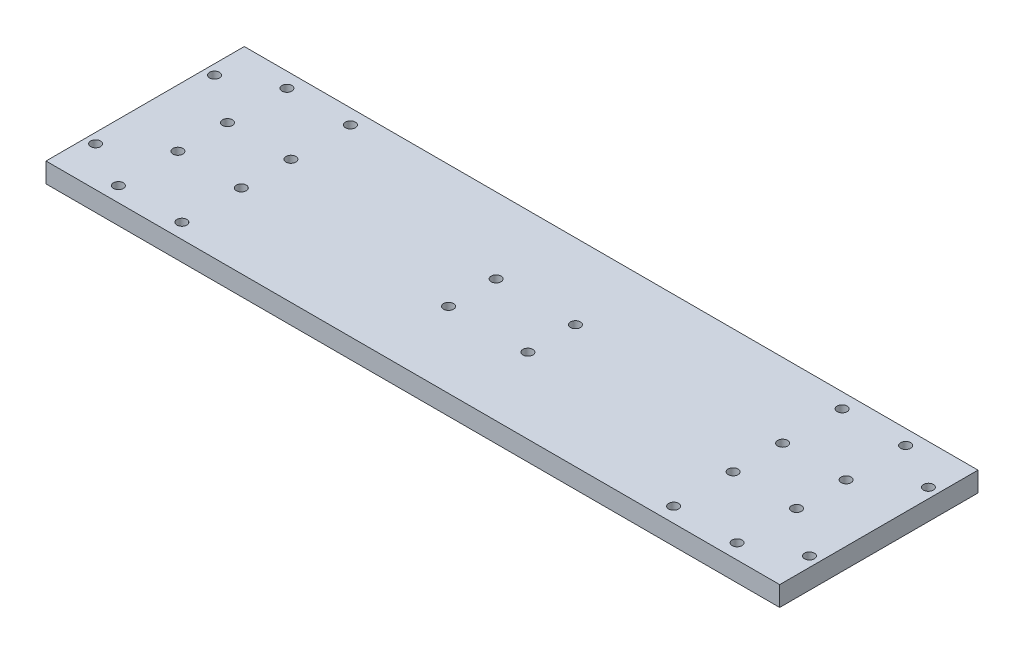
ISO-10303-21;
HEADER;
FILE_DESCRIPTION(('STEP AP214'),'2;1');
FILE_NAME('part.step','',(''),(''),'','','');
FILE_SCHEMA(('AUTOMOTIVE_DESIGN { 1 0 10303 214 1 1 1 1 }'));
ENDSEC;
DATA;
#1=APPLICATION_CONTEXT('core data for automotive mechanical design processes');
#2=APPLICATION_PROTOCOL_DEFINITION('international standard','automotive_design',2000,#1);
#3=PRODUCT_CONTEXT('',#1,'mechanical');
#4=PRODUCT('Part','Part','',(#3));
#5=PRODUCT_RELATED_PRODUCT_CATEGORY('part','',(#4));
#6=PRODUCT_DEFINITION_FORMATION('','',#4);
#7=PRODUCT_DEFINITION_CONTEXT('part definition',#1,'design');
#8=PRODUCT_DEFINITION('design','',#6,#7);
#9=PRODUCT_DEFINITION_SHAPE('','',#8);
#10=(LENGTH_UNIT() NAMED_UNIT(*) SI_UNIT(.MILLI.,.METRE.));
#11=(NAMED_UNIT(*) PLANE_ANGLE_UNIT() SI_UNIT($,.RADIAN.));
#12=(NAMED_UNIT(*) SI_UNIT($,.STERADIAN.) SOLID_ANGLE_UNIT());
#13=UNCERTAINTY_MEASURE_WITH_UNIT(LENGTH_MEASURE(1.E-05),#10,'distance_accuracy_value','');
#14=(GEOMETRIC_REPRESENTATION_CONTEXT(3) GLOBAL_UNCERTAINTY_ASSIGNED_CONTEXT((#13)) GLOBAL_UNIT_ASSIGNED_CONTEXT((#10,
#11,#12)) REPRESENTATION_CONTEXT('',''));
#15=CARTESIAN_POINT('',(0.,0.,0.));
#16=DIRECTION('',(0.,0.,1.));
#17=DIRECTION('',(1.,0.,0.));
#18=AXIS2_PLACEMENT_3D('',#15,#16,#17);
#19=CARTESIAN_POINT('',(-185.,10.,50.));
#20=DIRECTION('',(1.,0.,0.));
#21=DIRECTION('',(0.,0.,-1.));
#22=AXIS2_PLACEMENT_3D('',#19,#20,#21);
#23=PLANE('',#22);
#24=DIRECTION('',(0.,0.,1.));
#25=VECTOR('',#24,1.);
#26=CARTESIAN_POINT('',(-185.,0.,50.));
#27=LINE('',#26,#25);
#28=CARTESIAN_POINT('',(-185.,0.,-50.));
#29=VERTEX_POINT('',#28);
#30=CARTESIAN_POINT('',(-185.,0.,50.));
#31=VERTEX_POINT('',#30);
#32=EDGE_CURVE('E95',#29,#31,#27,.T.);
#33=ORIENTED_EDGE('',*,*,#32,.T.);
#34=DIRECTION('',(0.,-1.,0.));
#35=VECTOR('',#34,1.);
#36=CARTESIAN_POINT('',(-185.,10.,50.));
#37=LINE('',#36,#35);
#38=CARTESIAN_POINT('',(-185.,10.,50.));
#39=VERTEX_POINT('',#38);
#40=EDGE_CURVE('E11',#39,#31,#37,.T.);
#41=ORIENTED_EDGE('',*,*,#40,.F.);
#42=DIRECTION('',(0.,0.,1.));
#43=VECTOR('',#42,1.);
#44=CARTESIAN_POINT('',(-185.,10.,50.));
#45=LINE('',#44,#43);
#46=CARTESIAN_POINT('',(-185.,10.,-50.));
#47=VERTEX_POINT('',#46);
#48=EDGE_CURVE('E83',#47,#39,#45,.T.);
#49=ORIENTED_EDGE('',*,*,#48,.F.);
#50=DIRECTION('',(0.,-1.,0.));
#51=VECTOR('',#50,1.);
#52=CARTESIAN_POINT('',(-185.,10.,-50.));
#53=LINE('',#52,#51);
#54=EDGE_CURVE('E91',#47,#29,#53,.T.);
#55=ORIENTED_EDGE('',*,*,#54,.T.);
#56=EDGE_LOOP('',(#33,#41,#49,#55));
#57=FACE_BOUND('',#56,.T.);
#58=ADVANCED_FACE('F32',(#57),#23,.F.);
#59=CARTESIAN_POINT('',(185.,10.,50.));
#60=DIRECTION('',(0.,0.,-1.));
#61=DIRECTION('',(-1.,0.,0.));
#62=AXIS2_PLACEMENT_3D('',#59,#60,#61);
#63=PLANE('',#62);
#64=DIRECTION('',(1.,0.,0.));
#65=VECTOR('',#64,1.);
#66=CARTESIAN_POINT('',(185.,0.,50.));
#67=LINE('',#66,#65);
#68=CARTESIAN_POINT('',(185.,0.,50.));
#69=VERTEX_POINT('',#68);
#70=EDGE_CURVE('E87',#31,#69,#67,.T.);
#71=ORIENTED_EDGE('',*,*,#70,.T.);
#72=DIRECTION('',(0.,-1.,0.));
#73=VECTOR('',#72,1.);
#74=CARTESIAN_POINT('',(185.,10.,50.));
#75=LINE('',#74,#73);
#76=CARTESIAN_POINT('',(185.,10.,50.));
#77=VERTEX_POINT('',#76);
#78=EDGE_CURVE('E40',#77,#69,#75,.T.);
#79=ORIENTED_EDGE('',*,*,#78,.F.);
#80=DIRECTION('',(1.,0.,0.));
#81=VECTOR('',#80,1.);
#82=CARTESIAN_POINT('',(185.,10.,50.));
#83=LINE('',#82,#81);
#84=EDGE_CURVE('E78',#39,#77,#83,.T.);
#85=ORIENTED_EDGE('',*,*,#84,.F.);
#86=ORIENTED_EDGE('',*,*,#40,.T.);
#87=EDGE_LOOP('',(#71,#79,#85,#86));
#88=FACE_BOUND('',#87,.T.);
#89=ADVANCED_FACE('F86',(#88),#63,.F.);
#90=CARTESIAN_POINT('',(185.,10.,50.));
#91=DIRECTION('',(-1.,0.,0.));
#92=DIRECTION('',(0.,0.,1.));
#93=AXIS2_PLACEMENT_3D('',#90,#91,#92);
#94=PLANE('',#93);
#95=DIRECTION('',(0.,0.,-1.));
#96=VECTOR('',#95,1.);
#97=CARTESIAN_POINT('',(185.,0.,50.));
#98=LINE('',#97,#96);
#99=CARTESIAN_POINT('',(185.,0.,-50.));
#100=VERTEX_POINT('',#99);
#101=EDGE_CURVE('E65',#69,#100,#98,.T.);
#102=ORIENTED_EDGE('',*,*,#101,.T.);
#103=DIRECTION('',(0.,-1.,0.));
#104=VECTOR('',#103,1.);
#105=CARTESIAN_POINT('',(185.,10.,-50.));
#106=LINE('',#105,#104);
#107=CARTESIAN_POINT('',(185.,10.,-50.));
#108=VERTEX_POINT('',#107);
#109=EDGE_CURVE('E88',#108,#100,#106,.T.);
#110=ORIENTED_EDGE('',*,*,#109,.F.);
#111=DIRECTION('',(0.,0.,-1.));
#112=VECTOR('',#111,1.);
#113=CARTESIAN_POINT('',(185.,10.,50.));
#114=LINE('',#113,#112);
#115=EDGE_CURVE('E81',#77,#108,#114,.T.);
#116=ORIENTED_EDGE('',*,*,#115,.F.);
#117=ORIENTED_EDGE('',*,*,#78,.T.);
#118=EDGE_LOOP('',(#102,#110,#116,#117));
#119=FACE_BOUND('',#118,.T.);
#120=ADVANCED_FACE('F89',(#119),#94,.F.);
#121=CARTESIAN_POINT('',(185.,10.,-50.));
#122=DIRECTION('',(0.,0.,1.));
#123=DIRECTION('',(1.,0.,0.));
#124=AXIS2_PLACEMENT_3D('',#121,#122,#123);
#125=PLANE('',#124);
#126=DIRECTION('',(-1.,0.,0.));
#127=VECTOR('',#126,1.);
#128=CARTESIAN_POINT('',(185.,0.,-50.));
#129=LINE('',#128,#127);
#130=EDGE_CURVE('E71',#100,#29,#129,.T.);
#131=ORIENTED_EDGE('',*,*,#130,.T.);
#132=ORIENTED_EDGE('',*,*,#54,.F.);
#133=DIRECTION('',(-1.,0.,0.));
#134=VECTOR('',#133,1.);
#135=CARTESIAN_POINT('',(185.,10.,-50.));
#136=LINE('',#135,#134);
#137=EDGE_CURVE('E48',#108,#47,#136,.T.);
#138=ORIENTED_EDGE('',*,*,#137,.F.);
#139=ORIENTED_EDGE('',*,*,#109,.T.);
#140=EDGE_LOOP('',(#131,#132,#138,#139));
#141=FACE_BOUND('',#140,.T.);
#142=ADVANCED_FACE('F103',(#141),#125,.F.);
#143=CARTESIAN_POINT('',(0.,10.,0.));
#144=DIRECTION('',(0.,1.,0.));
#145=DIRECTION('',(0.,0.,1.));
#146=AXIS2_PLACEMENT_3D('',#143,#144,#145);
#147=PLANE('',#146);
#148=CARTESIAN_POINT('',(180.,10.,30.));
#149=DIRECTION('',(0.,-1.,0.));
#150=DIRECTION('',(0.,0.,-1.));
#151=AXIS2_PLACEMENT_3D('',#148,#149,#150);
#152=CIRCLE('',#151,2.5);
#153=CARTESIAN_POINT('',(180.,10.,27.5));
#154=VERTEX_POINT('',#153);
#155=EDGE_CURVE('E244',#154,#154,#152,.T.);
#156=ORIENTED_EDGE('',*,*,#155,.T.);
#157=EDGE_LOOP('',(#156));
#158=FACE_BOUND('',#157,.T.);
#159=CARTESIAN_POINT('',(180.,10.,-30.));
#160=DIRECTION('',(0.,-1.,0.));
#161=DIRECTION('',(0.,0.,-1.));
#162=AXIS2_PLACEMENT_3D('',#159,#160,#161);
#163=CIRCLE('',#162,2.5);
#164=CARTESIAN_POINT('',(180.,10.,-32.5));
#165=VERTEX_POINT('',#164);
#166=EDGE_CURVE('E238',#165,#165,#163,.T.);
#167=ORIENTED_EDGE('',*,*,#166,.T.);
#168=EDGE_LOOP('',(#167));
#169=FACE_BOUND('',#168,.T.);
#170=CARTESIAN_POINT('',(-180.,10.,-30.));
#171=DIRECTION('',(0.,-1.,0.));
#172=DIRECTION('',(0.,0.,-1.));
#173=AXIS2_PLACEMENT_3D('',#170,#171,#172);
#174=CIRCLE('',#173,2.5);
#175=CARTESIAN_POINT('',(-180.,10.,-32.5));
#176=VERTEX_POINT('',#175);
#177=EDGE_CURVE('E232',#176,#176,#174,.T.);
#178=ORIENTED_EDGE('',*,*,#177,.T.);
#179=EDGE_LOOP('',(#178));
#180=FACE_BOUND('',#179,.T.);
#181=CARTESIAN_POINT('',(-180.,10.,30.));
#182=DIRECTION('',(0.,-1.,0.));
#183=DIRECTION('',(0.,0.,-1.));
#184=AXIS2_PLACEMENT_3D('',#181,#182,#183);
#185=CIRCLE('',#184,2.5);
#186=CARTESIAN_POINT('',(-180.,10.,27.5));
#187=VERTEX_POINT('',#186);
#188=EDGE_CURVE('E226',#187,#187,#185,.T.);
#189=ORIENTED_EDGE('',*,*,#188,.T.);
#190=EDGE_LOOP('',(#189));
#191=FACE_BOUND('',#190,.T.);
#192=CARTESIAN_POINT('',(-20.,10.,-12.));
#193=DIRECTION('',(0.,-1.,0.));
#194=DIRECTION('',(0.,0.,-1.));
#195=AXIS2_PLACEMENT_3D('',#192,#193,#194);
#196=CIRCLE('',#195,2.5);
#197=CARTESIAN_POINT('',(-20.,10.,-14.5));
#198=VERTEX_POINT('',#197);
#199=EDGE_CURVE('E220',#198,#198,#196,.T.);
#200=ORIENTED_EDGE('',*,*,#199,.T.);
#201=EDGE_LOOP('',(#200));
#202=FACE_BOUND('',#201,.T.);
#203=CARTESIAN_POINT('',(20.,10.,-12.));
#204=DIRECTION('',(0.,-1.,0.));
#205=DIRECTION('',(0.,0.,-1.));
#206=AXIS2_PLACEMENT_3D('',#203,#204,#205);
#207=CIRCLE('',#206,2.5);
#208=CARTESIAN_POINT('',(20.,10.,-14.5));
#209=VERTEX_POINT('',#208);
#210=EDGE_CURVE('E214',#209,#209,#207,.T.);
#211=ORIENTED_EDGE('',*,*,#210,.T.);
#212=EDGE_LOOP('',(#211));
#213=FACE_BOUND('',#212,.T.);
#214=CARTESIAN_POINT('',(20.,10.,12.));
#215=DIRECTION('',(0.,-1.,0.));
#216=DIRECTION('',(0.,0.,-1.));
#217=AXIS2_PLACEMENT_3D('',#214,#215,#216);
#218=CIRCLE('',#217,2.5);
#219=CARTESIAN_POINT('',(20.,10.,9.49999999999998));
#220=VERTEX_POINT('',#219);
#221=EDGE_CURVE('E208',#220,#220,#218,.T.);
#222=ORIENTED_EDGE('',*,*,#221,.T.);
#223=EDGE_LOOP('',(#222));
#224=FACE_BOUND('',#223,.T.);
#225=CARTESIAN_POINT('',(-20.,10.,12.));
#226=DIRECTION('',(0.,-1.,0.));
#227=DIRECTION('',(0.,0.,-1.));
#228=AXIS2_PLACEMENT_3D('',#225,#226,#227);
#229=CIRCLE('',#228,2.5);
#230=CARTESIAN_POINT('',(-20.,10.,9.49999999999998));
#231=VERTEX_POINT('',#230);
#232=EDGE_CURVE('E202',#231,#231,#229,.T.);
#233=ORIENTED_EDGE('',*,*,#232,.T.);
#234=EDGE_LOOP('',(#233));
#235=FACE_BOUND('',#234,.T.);
#236=CARTESIAN_POINT('',(156.000000000001,10.,-42.5));
#237=DIRECTION('',(0.,-1.,0.));
#238=DIRECTION('',(0.,0.,-1.));
#239=AXIS2_PLACEMENT_3D('',#236,#237,#238);
#240=CIRCLE('',#239,2.49999999999997);
#241=CARTESIAN_POINT('',(156.000000000001,10.,-45.));
#242=VERTEX_POINT('',#241);
#243=EDGE_CURVE('E196',#242,#242,#240,.T.);
#244=ORIENTED_EDGE('',*,*,#243,.T.);
#245=EDGE_LOOP('',(#244));
#246=FACE_BOUND('',#245,.T.);
#247=CARTESIAN_POINT('',(124.000000000001,10.,-42.5));
#248=DIRECTION('',(0.,-1.,0.));
#249=DIRECTION('',(0.,0.,-1.));
#250=AXIS2_PLACEMENT_3D('',#247,#248,#249);
#251=CIRCLE('',#250,2.49999999999997);
#252=CARTESIAN_POINT('',(124.000000000001,10.,-45.));
#253=VERTEX_POINT('',#252);
#254=EDGE_CURVE('E190',#253,#253,#251,.T.);
#255=ORIENTED_EDGE('',*,*,#254,.T.);
#256=EDGE_LOOP('',(#255));
#257=FACE_BOUND('',#256,.T.);
#258=CARTESIAN_POINT('',(-123.999999999999,10.,-42.4999999999999));
#259=DIRECTION('',(0.,-1.,0.));
#260=DIRECTION('',(0.,0.,-1.));
#261=AXIS2_PLACEMENT_3D('',#258,#259,#260);
#262=CIRCLE('',#261,2.49999999999997);
#263=CARTESIAN_POINT('',(-123.999999999999,10.,-44.9999999999999));
#264=VERTEX_POINT('',#263);
#265=EDGE_CURVE('E184',#264,#264,#262,.T.);
#266=ORIENTED_EDGE('',*,*,#265,.T.);
#267=EDGE_LOOP('',(#266));
#268=FACE_BOUND('',#267,.T.);
#269=CARTESIAN_POINT('',(156.000000000001,10.,-12.5));
#270=DIRECTION('',(0.,-1.,0.));
#271=DIRECTION('',(0.,0.,-1.));
#272=AXIS2_PLACEMENT_3D('',#269,#270,#271);
#273=CIRCLE('',#272,2.49999999999997);
#274=CARTESIAN_POINT('',(156.000000000001,10.,-15.));
#275=VERTEX_POINT('',#274);
#276=EDGE_CURVE('E178',#275,#275,#273,.T.);
#277=ORIENTED_EDGE('',*,*,#276,.T.);
#278=EDGE_LOOP('',(#277));
#279=FACE_BOUND('',#278,.T.);
#280=CARTESIAN_POINT('',(124.000000000001,10.,-12.5));
#281=DIRECTION('',(0.,-1.,0.));
#282=DIRECTION('',(0.,0.,-1.));
#283=AXIS2_PLACEMENT_3D('',#280,#281,#282);
#284=CIRCLE('',#283,2.49999999999997);
#285=CARTESIAN_POINT('',(124.000000000001,10.,-15.));
#286=VERTEX_POINT('',#285);
#287=EDGE_CURVE('E172',#286,#286,#284,.T.);
#288=ORIENTED_EDGE('',*,*,#287,.T.);
#289=EDGE_LOOP('',(#288));
#290=FACE_BOUND('',#289,.T.);
#291=CARTESIAN_POINT('',(-123.999999999999,10.,-12.4999999999999));
#292=DIRECTION('',(0.,-1.,0.));
#293=DIRECTION('',(0.,0.,-1.));
#294=AXIS2_PLACEMENT_3D('',#291,#292,#293);
#295=CIRCLE('',#294,2.49999999999997);
#296=CARTESIAN_POINT('',(-123.999999999999,10.,-14.9999999999999));
#297=VERTEX_POINT('',#296);
#298=EDGE_CURVE('E166',#297,#297,#295,.T.);
#299=ORIENTED_EDGE('',*,*,#298,.T.);
#300=EDGE_LOOP('',(#299));
#301=FACE_BOUND('',#300,.T.);
#302=CARTESIAN_POINT('',(-155.999999999999,10.,-12.4999999999999));
#303=DIRECTION('',(0.,-1.,0.));
#304=DIRECTION('',(0.,0.,-1.));
#305=AXIS2_PLACEMENT_3D('',#302,#303,#304);
#306=CIRCLE('',#305,2.49999999999997);
#307=CARTESIAN_POINT('',(-155.999999999999,10.,-14.9999999999999));
#308=VERTEX_POINT('',#307);
#309=EDGE_CURVE('E160',#308,#308,#306,.T.);
#310=ORIENTED_EDGE('',*,*,#309,.T.);
#311=EDGE_LOOP('',(#310));
#312=FACE_BOUND('',#311,.T.);
#313=CARTESIAN_POINT('',(-155.999999999999,10.,-42.4999999999999));
#314=DIRECTION('',(0.,-1.,0.));
#315=DIRECTION('',(0.,0.,-1.));
#316=AXIS2_PLACEMENT_3D('',#313,#314,#315);
#317=CIRCLE('',#316,2.49999999999997);
#318=CARTESIAN_POINT('',(-155.999999999999,10.,-44.9999999999999));
#319=VERTEX_POINT('',#318);
#320=EDGE_CURVE('E154',#319,#319,#317,.T.);
#321=ORIENTED_EDGE('',*,*,#320,.T.);
#322=EDGE_LOOP('',(#321));
#323=FACE_BOUND('',#322,.T.);
#324=CARTESIAN_POINT('',(156.,10.,12.5));
#325=DIRECTION('',(0.,-1.,0.));
#326=DIRECTION('',(0.,0.,-1.));
#327=AXIS2_PLACEMENT_3D('',#324,#325,#326);
#328=CIRCLE('',#327,2.49999999999997);
#329=CARTESIAN_POINT('',(156.,10.,9.99999999999999));
#330=VERTEX_POINT('',#329);
#331=EDGE_CURVE('E148',#330,#330,#328,.T.);
#332=ORIENTED_EDGE('',*,*,#331,.T.);
#333=EDGE_LOOP('',(#332));
#334=FACE_BOUND('',#333,.T.);
#335=CARTESIAN_POINT('',(124.,10.,12.5));
#336=DIRECTION('',(0.,-1.,0.));
#337=DIRECTION('',(0.,0.,-1.));
#338=AXIS2_PLACEMENT_3D('',#335,#336,#337);
#339=CIRCLE('',#338,2.49999999999995);
#340=CARTESIAN_POINT('',(124.,10.,10.));
#341=VERTEX_POINT('',#340);
#342=EDGE_CURVE('E142',#341,#341,#339,.T.);
#343=ORIENTED_EDGE('',*,*,#342,.T.);
#344=EDGE_LOOP('',(#343));
#345=FACE_BOUND('',#344,.T.);
#346=CARTESIAN_POINT('',(-124.,10.,12.5000000000001));
#347=DIRECTION('',(0.,-1.,0.));
#348=DIRECTION('',(0.,0.,-1.));
#349=AXIS2_PLACEMENT_3D('',#346,#347,#348);
#350=CIRCLE('',#349,2.49999999999997);
#351=CARTESIAN_POINT('',(-124.,10.,10.0000000000001));
#352=VERTEX_POINT('',#351);
#353=EDGE_CURVE('E136',#352,#352,#350,.T.);
#354=ORIENTED_EDGE('',*,*,#353,.T.);
#355=EDGE_LOOP('',(#354));
#356=FACE_BOUND('',#355,.T.);
#357=CARTESIAN_POINT('',(-156.,10.,12.5000000000001));
#358=DIRECTION('',(0.,-1.,0.));
#359=DIRECTION('',(0.,0.,-1.));
#360=AXIS2_PLACEMENT_3D('',#357,#358,#359);
#361=CIRCLE('',#360,2.49999999999997);
#362=CARTESIAN_POINT('',(-156.,10.,10.0000000000001));
#363=VERTEX_POINT('',#362);
#364=EDGE_CURVE('E130',#363,#363,#361,.T.);
#365=ORIENTED_EDGE('',*,*,#364,.T.);
#366=EDGE_LOOP('',(#365));
#367=FACE_BOUND('',#366,.T.);
#368=CARTESIAN_POINT('',(156.,10.,42.5));
#369=DIRECTION('',(0.,-1.,0.));
#370=DIRECTION('',(0.,0.,-1.));
#371=AXIS2_PLACEMENT_3D('',#368,#369,#370);
#372=CIRCLE('',#371,2.49999999999997);
#373=CARTESIAN_POINT('',(156.,10.,40.));
#374=VERTEX_POINT('',#373);
#375=EDGE_CURVE('E124',#374,#374,#372,.T.);
#376=ORIENTED_EDGE('',*,*,#375,.T.);
#377=EDGE_LOOP('',(#376));
#378=FACE_BOUND('',#377,.T.);
#379=CARTESIAN_POINT('',(124.,10.,42.5));
#380=DIRECTION('',(0.,-1.,0.));
#381=DIRECTION('',(0.,0.,-1.));
#382=AXIS2_PLACEMENT_3D('',#379,#380,#381);
#383=CIRCLE('',#382,2.49999999999997);
#384=CARTESIAN_POINT('',(124.,10.,40.));
#385=VERTEX_POINT('',#384);
#386=EDGE_CURVE('E118',#385,#385,#383,.T.);
#387=ORIENTED_EDGE('',*,*,#386,.T.);
#388=EDGE_LOOP('',(#387));
#389=FACE_BOUND('',#388,.T.);
#390=CARTESIAN_POINT('',(-124.,10.,42.5000000000001));
#391=DIRECTION('',(0.,-1.,0.));
#392=DIRECTION('',(0.,0.,-1.));
#393=AXIS2_PLACEMENT_3D('',#390,#391,#392);
#394=CIRCLE('',#393,2.49999999999997);
#395=CARTESIAN_POINT('',(-124.,10.,40.0000000000001));
#396=VERTEX_POINT('',#395);
#397=EDGE_CURVE('E112',#396,#396,#394,.T.);
#398=ORIENTED_EDGE('',*,*,#397,.T.);
#399=EDGE_LOOP('',(#398));
#400=FACE_BOUND('',#399,.T.);
#401=CARTESIAN_POINT('',(-156.,10.,42.5000000000001));
#402=DIRECTION('',(0.,-1.,0.));
#403=DIRECTION('',(0.,0.,-1.));
#404=AXIS2_PLACEMENT_3D('',#401,#402,#403);
#405=CIRCLE('',#404,2.49999999999997);
#406=CARTESIAN_POINT('',(-156.,10.,40.0000000000001));
#407=VERTEX_POINT('',#406);
#408=EDGE_CURVE('E98',#407,#407,#405,.T.);
#409=ORIENTED_EDGE('',*,*,#408,.T.);
#410=EDGE_LOOP('',(#409));
#411=FACE_BOUND('',#410,.T.);
#412=ORIENTED_EDGE('',*,*,#48,.T.);
#413=ORIENTED_EDGE('',*,*,#84,.T.);
#414=ORIENTED_EDGE('',*,*,#115,.T.);
#415=ORIENTED_EDGE('',*,*,#137,.T.);
#416=EDGE_LOOP('',(#412,#413,#414,#415));
#417=FACE_BOUND('',#416,.T.);
#418=ADVANCED_FACE('F79',(#158,#169,#180,#191,#202,#213,#224,#235,#246,#257,#268,#279,#290,#301,
#312,#323,#334,#345,#356,#367,#378,#389,#400,#411,#417),#147,.T.);
#419=CARTESIAN_POINT('',(0.,0.,0.));
#420=DIRECTION('',(0.,1.,0.));
#421=DIRECTION('',(0.,0.,1.));
#422=AXIS2_PLACEMENT_3D('',#419,#420,#421);
#423=PLANE('',#422);
#424=CARTESIAN_POINT('',(180.,0.,30.));
#425=DIRECTION('',(0.,-1.,0.));
#426=DIRECTION('',(0.,0.,-1.));
#427=AXIS2_PLACEMENT_3D('',#424,#425,#426);
#428=CIRCLE('',#427,2.5);
#429=CARTESIAN_POINT('',(180.,0.,27.5));
#430=VERTEX_POINT('',#429);
#431=EDGE_CURVE('E247',#430,#430,#428,.T.);
#432=ORIENTED_EDGE('',*,*,#431,.F.);
#433=EDGE_LOOP('',(#432));
#434=FACE_BOUND('',#433,.T.);
#435=CARTESIAN_POINT('',(180.,0.,-30.));
#436=DIRECTION('',(0.,-1.,0.));
#437=DIRECTION('',(0.,0.,-1.));
#438=AXIS2_PLACEMENT_3D('',#435,#436,#437);
#439=CIRCLE('',#438,2.5);
#440=CARTESIAN_POINT('',(180.,0.,-32.5));
#441=VERTEX_POINT('',#440);
#442=EDGE_CURVE('E241',#441,#441,#439,.T.);
#443=ORIENTED_EDGE('',*,*,#442,.F.);
#444=EDGE_LOOP('',(#443));
#445=FACE_BOUND('',#444,.T.);
#446=CARTESIAN_POINT('',(-180.,0.,-30.));
#447=DIRECTION('',(0.,-1.,0.));
#448=DIRECTION('',(0.,0.,-1.));
#449=AXIS2_PLACEMENT_3D('',#446,#447,#448);
#450=CIRCLE('',#449,2.5);
#451=CARTESIAN_POINT('',(-180.,0.,-32.5));
#452=VERTEX_POINT('',#451);
#453=EDGE_CURVE('E235',#452,#452,#450,.T.);
#454=ORIENTED_EDGE('',*,*,#453,.F.);
#455=EDGE_LOOP('',(#454));
#456=FACE_BOUND('',#455,.T.);
#457=CARTESIAN_POINT('',(-180.,0.,30.));
#458=DIRECTION('',(0.,-1.,0.));
#459=DIRECTION('',(0.,0.,-1.));
#460=AXIS2_PLACEMENT_3D('',#457,#458,#459);
#461=CIRCLE('',#460,2.5);
#462=CARTESIAN_POINT('',(-180.,0.,27.5));
#463=VERTEX_POINT('',#462);
#464=EDGE_CURVE('E229',#463,#463,#461,.T.);
#465=ORIENTED_EDGE('',*,*,#464,.F.);
#466=EDGE_LOOP('',(#465));
#467=FACE_BOUND('',#466,.T.);
#468=CARTESIAN_POINT('',(-20.,0.,-12.));
#469=DIRECTION('',(0.,-1.,0.));
#470=DIRECTION('',(0.,0.,-1.));
#471=AXIS2_PLACEMENT_3D('',#468,#469,#470);
#472=CIRCLE('',#471,2.5);
#473=CARTESIAN_POINT('',(-20.,0.,-14.5));
#474=VERTEX_POINT('',#473);
#475=EDGE_CURVE('E223',#474,#474,#472,.T.);
#476=ORIENTED_EDGE('',*,*,#475,.F.);
#477=EDGE_LOOP('',(#476));
#478=FACE_BOUND('',#477,.T.);
#479=CARTESIAN_POINT('',(20.,0.,-12.));
#480=DIRECTION('',(0.,-1.,0.));
#481=DIRECTION('',(0.,0.,-1.));
#482=AXIS2_PLACEMENT_3D('',#479,#480,#481);
#483=CIRCLE('',#482,2.5);
#484=CARTESIAN_POINT('',(20.,0.,-14.5));
#485=VERTEX_POINT('',#484);
#486=EDGE_CURVE('E217',#485,#485,#483,.T.);
#487=ORIENTED_EDGE('',*,*,#486,.F.);
#488=EDGE_LOOP('',(#487));
#489=FACE_BOUND('',#488,.T.);
#490=CARTESIAN_POINT('',(20.,0.,12.));
#491=DIRECTION('',(0.,-1.,0.));
#492=DIRECTION('',(0.,0.,-1.));
#493=AXIS2_PLACEMENT_3D('',#490,#491,#492);
#494=CIRCLE('',#493,2.5);
#495=CARTESIAN_POINT('',(20.,0.,9.49999999999998));
#496=VERTEX_POINT('',#495);
#497=EDGE_CURVE('E211',#496,#496,#494,.T.);
#498=ORIENTED_EDGE('',*,*,#497,.F.);
#499=EDGE_LOOP('',(#498));
#500=FACE_BOUND('',#499,.T.);
#501=CARTESIAN_POINT('',(-20.,0.,12.));
#502=DIRECTION('',(0.,-1.,0.));
#503=DIRECTION('',(0.,0.,-1.));
#504=AXIS2_PLACEMENT_3D('',#501,#502,#503);
#505=CIRCLE('',#504,2.5);
#506=CARTESIAN_POINT('',(-20.,0.,9.49999999999998));
#507=VERTEX_POINT('',#506);
#508=EDGE_CURVE('E205',#507,#507,#505,.T.);
#509=ORIENTED_EDGE('',*,*,#508,.F.);
#510=EDGE_LOOP('',(#509));
#511=FACE_BOUND('',#510,.T.);
#512=CARTESIAN_POINT('',(156.000000000001,0.,-42.5));
#513=DIRECTION('',(0.,-1.,0.));
#514=DIRECTION('',(0.,0.,-1.));
#515=AXIS2_PLACEMENT_3D('',#512,#513,#514);
#516=CIRCLE('',#515,2.49999999999997);
#517=CARTESIAN_POINT('',(156.000000000001,0.,-45.));
#518=VERTEX_POINT('',#517);
#519=EDGE_CURVE('E199',#518,#518,#516,.T.);
#520=ORIENTED_EDGE('',*,*,#519,.F.);
#521=EDGE_LOOP('',(#520));
#522=FACE_BOUND('',#521,.T.);
#523=CARTESIAN_POINT('',(124.000000000001,0.,-42.5));
#524=DIRECTION('',(0.,-1.,0.));
#525=DIRECTION('',(0.,0.,-1.));
#526=AXIS2_PLACEMENT_3D('',#523,#524,#525);
#527=CIRCLE('',#526,2.49999999999997);
#528=CARTESIAN_POINT('',(124.000000000001,0.,-45.));
#529=VERTEX_POINT('',#528);
#530=EDGE_CURVE('E193',#529,#529,#527,.T.);
#531=ORIENTED_EDGE('',*,*,#530,.F.);
#532=EDGE_LOOP('',(#531));
#533=FACE_BOUND('',#532,.T.);
#534=CARTESIAN_POINT('',(-123.999999999999,0.,-42.4999999999999));
#535=DIRECTION('',(0.,-1.,0.));
#536=DIRECTION('',(0.,0.,-1.));
#537=AXIS2_PLACEMENT_3D('',#534,#535,#536);
#538=CIRCLE('',#537,2.49999999999997);
#539=CARTESIAN_POINT('',(-123.999999999999,0.,-44.9999999999999));
#540=VERTEX_POINT('',#539);
#541=EDGE_CURVE('E187',#540,#540,#538,.T.);
#542=ORIENTED_EDGE('',*,*,#541,.F.);
#543=EDGE_LOOP('',(#542));
#544=FACE_BOUND('',#543,.T.);
#545=CARTESIAN_POINT('',(156.000000000001,0.,-12.5));
#546=DIRECTION('',(0.,-1.,0.));
#547=DIRECTION('',(0.,0.,-1.));
#548=AXIS2_PLACEMENT_3D('',#545,#546,#547);
#549=CIRCLE('',#548,2.49999999999997);
#550=CARTESIAN_POINT('',(156.000000000001,0.,-15.));
#551=VERTEX_POINT('',#550);
#552=EDGE_CURVE('E181',#551,#551,#549,.T.);
#553=ORIENTED_EDGE('',*,*,#552,.F.);
#554=EDGE_LOOP('',(#553));
#555=FACE_BOUND('',#554,.T.);
#556=CARTESIAN_POINT('',(124.000000000001,0.,-12.5));
#557=DIRECTION('',(0.,-1.,0.));
#558=DIRECTION('',(0.,0.,-1.));
#559=AXIS2_PLACEMENT_3D('',#556,#557,#558);
#560=CIRCLE('',#559,2.49999999999997);
#561=CARTESIAN_POINT('',(124.000000000001,0.,-15.));
#562=VERTEX_POINT('',#561);
#563=EDGE_CURVE('E175',#562,#562,#560,.T.);
#564=ORIENTED_EDGE('',*,*,#563,.F.);
#565=EDGE_LOOP('',(#564));
#566=FACE_BOUND('',#565,.T.);
#567=CARTESIAN_POINT('',(-123.999999999999,0.,-12.4999999999999));
#568=DIRECTION('',(0.,-1.,0.));
#569=DIRECTION('',(0.,0.,-1.));
#570=AXIS2_PLACEMENT_3D('',#567,#568,#569);
#571=CIRCLE('',#570,2.49999999999997);
#572=CARTESIAN_POINT('',(-123.999999999999,0.,-14.9999999999999));
#573=VERTEX_POINT('',#572);
#574=EDGE_CURVE('E169',#573,#573,#571,.T.);
#575=ORIENTED_EDGE('',*,*,#574,.F.);
#576=EDGE_LOOP('',(#575));
#577=FACE_BOUND('',#576,.T.);
#578=CARTESIAN_POINT('',(-155.999999999999,0.,-12.4999999999999));
#579=DIRECTION('',(0.,-1.,0.));
#580=DIRECTION('',(0.,0.,-1.));
#581=AXIS2_PLACEMENT_3D('',#578,#579,#580);
#582=CIRCLE('',#581,2.49999999999997);
#583=CARTESIAN_POINT('',(-155.999999999999,0.,-14.9999999999999));
#584=VERTEX_POINT('',#583);
#585=EDGE_CURVE('E163',#584,#584,#582,.T.);
#586=ORIENTED_EDGE('',*,*,#585,.F.);
#587=EDGE_LOOP('',(#586));
#588=FACE_BOUND('',#587,.T.);
#589=CARTESIAN_POINT('',(-155.999999999999,0.,-42.4999999999999));
#590=DIRECTION('',(0.,-1.,0.));
#591=DIRECTION('',(0.,0.,-1.));
#592=AXIS2_PLACEMENT_3D('',#589,#590,#591);
#593=CIRCLE('',#592,2.49999999999997);
#594=CARTESIAN_POINT('',(-155.999999999999,0.,-44.9999999999999));
#595=VERTEX_POINT('',#594);
#596=EDGE_CURVE('E157',#595,#595,#593,.T.);
#597=ORIENTED_EDGE('',*,*,#596,.F.);
#598=EDGE_LOOP('',(#597));
#599=FACE_BOUND('',#598,.T.);
#600=CARTESIAN_POINT('',(156.,0.,12.5));
#601=DIRECTION('',(0.,-1.,0.));
#602=DIRECTION('',(0.,0.,-1.));
#603=AXIS2_PLACEMENT_3D('',#600,#601,#602);
#604=CIRCLE('',#603,2.49999999999997);
#605=CARTESIAN_POINT('',(156.,0.,9.99999999999999));
#606=VERTEX_POINT('',#605);
#607=EDGE_CURVE('E151',#606,#606,#604,.T.);
#608=ORIENTED_EDGE('',*,*,#607,.F.);
#609=EDGE_LOOP('',(#608));
#610=FACE_BOUND('',#609,.T.);
#611=CARTESIAN_POINT('',(124.,0.,12.5));
#612=DIRECTION('',(0.,-1.,0.));
#613=DIRECTION('',(0.,0.,-1.));
#614=AXIS2_PLACEMENT_3D('',#611,#612,#613);
#615=CIRCLE('',#614,2.49999999999995);
#616=CARTESIAN_POINT('',(124.,0.,10.));
#617=VERTEX_POINT('',#616);
#618=EDGE_CURVE('E145',#617,#617,#615,.T.);
#619=ORIENTED_EDGE('',*,*,#618,.F.);
#620=EDGE_LOOP('',(#619));
#621=FACE_BOUND('',#620,.T.);
#622=CARTESIAN_POINT('',(-124.,0.,12.5000000000001));
#623=DIRECTION('',(0.,-1.,0.));
#624=DIRECTION('',(0.,0.,-1.));
#625=AXIS2_PLACEMENT_3D('',#622,#623,#624);
#626=CIRCLE('',#625,2.49999999999997);
#627=CARTESIAN_POINT('',(-124.,0.,10.0000000000001));
#628=VERTEX_POINT('',#627);
#629=EDGE_CURVE('E139',#628,#628,#626,.T.);
#630=ORIENTED_EDGE('',*,*,#629,.F.);
#631=EDGE_LOOP('',(#630));
#632=FACE_BOUND('',#631,.T.);
#633=CARTESIAN_POINT('',(-156.,0.,12.5000000000001));
#634=DIRECTION('',(0.,-1.,0.));
#635=DIRECTION('',(0.,0.,-1.));
#636=AXIS2_PLACEMENT_3D('',#633,#634,#635);
#637=CIRCLE('',#636,2.49999999999997);
#638=CARTESIAN_POINT('',(-156.,0.,10.0000000000001));
#639=VERTEX_POINT('',#638);
#640=EDGE_CURVE('E133',#639,#639,#637,.T.);
#641=ORIENTED_EDGE('',*,*,#640,.F.);
#642=EDGE_LOOP('',(#641));
#643=FACE_BOUND('',#642,.T.);
#644=CARTESIAN_POINT('',(156.,0.,42.5));
#645=DIRECTION('',(0.,-1.,0.));
#646=DIRECTION('',(0.,0.,-1.));
#647=AXIS2_PLACEMENT_3D('',#644,#645,#646);
#648=CIRCLE('',#647,2.49999999999997);
#649=CARTESIAN_POINT('',(156.,0.,40.));
#650=VERTEX_POINT('',#649);
#651=EDGE_CURVE('E127',#650,#650,#648,.T.);
#652=ORIENTED_EDGE('',*,*,#651,.F.);
#653=EDGE_LOOP('',(#652));
#654=FACE_BOUND('',#653,.T.);
#655=CARTESIAN_POINT('',(124.,0.,42.5));
#656=DIRECTION('',(0.,-1.,0.));
#657=DIRECTION('',(0.,0.,-1.));
#658=AXIS2_PLACEMENT_3D('',#655,#656,#657);
#659=CIRCLE('',#658,2.49999999999997);
#660=CARTESIAN_POINT('',(124.,0.,40.));
#661=VERTEX_POINT('',#660);
#662=EDGE_CURVE('E121',#661,#661,#659,.T.);
#663=ORIENTED_EDGE('',*,*,#662,.F.);
#664=EDGE_LOOP('',(#663));
#665=FACE_BOUND('',#664,.T.);
#666=CARTESIAN_POINT('',(-124.,0.,42.5000000000001));
#667=DIRECTION('',(0.,-1.,0.));
#668=DIRECTION('',(0.,0.,-1.));
#669=AXIS2_PLACEMENT_3D('',#666,#667,#668);
#670=CIRCLE('',#669,2.49999999999997);
#671=CARTESIAN_POINT('',(-124.,0.,40.0000000000001));
#672=VERTEX_POINT('',#671);
#673=EDGE_CURVE('E115',#672,#672,#670,.T.);
#674=ORIENTED_EDGE('',*,*,#673,.F.);
#675=EDGE_LOOP('',(#674));
#676=FACE_BOUND('',#675,.T.);
#677=CARTESIAN_POINT('',(-156.,0.,42.5000000000001));
#678=DIRECTION('',(0.,-1.,0.));
#679=DIRECTION('',(0.,0.,-1.));
#680=AXIS2_PLACEMENT_3D('',#677,#678,#679);
#681=CIRCLE('',#680,2.49999999999997);
#682=CARTESIAN_POINT('',(-156.,0.,40.0000000000001));
#683=VERTEX_POINT('',#682);
#684=EDGE_CURVE('E109',#683,#683,#681,.T.);
#685=ORIENTED_EDGE('',*,*,#684,.F.);
#686=EDGE_LOOP('',(#685));
#687=FACE_BOUND('',#686,.T.);
#688=ORIENTED_EDGE('',*,*,#32,.F.);
#689=ORIENTED_EDGE('',*,*,#130,.F.);
#690=ORIENTED_EDGE('',*,*,#101,.F.);
#691=ORIENTED_EDGE('',*,*,#70,.F.);
#692=EDGE_LOOP('',(#688,#689,#690,#691));
#693=FACE_BOUND('',#692,.T.);
#694=ADVANCED_FACE('F106',(#434,#445,#456,#467,#478,#489,#500,#511,#522,#533,#544,#555,#566,
#577,#588,#599,#610,#621,#632,#643,#654,#665,#676,#687,#693),#423,.F.);
#695=CARTESIAN_POINT('',(-156.,10.,42.5000000000001));
#696=DIRECTION('',(0.,-1.,0.));
#697=DIRECTION('',(0.,0.,-1.));
#698=AXIS2_PLACEMENT_3D('',#695,#696,#697);
#699=CYLINDRICAL_SURFACE('',#698,2.49999999999997);
#700=ORIENTED_EDGE('',*,*,#408,.F.);
#701=EDGE_LOOP('',(#700));
#702=FACE_BOUND('',#701,.T.);
#703=ORIENTED_EDGE('',*,*,#684,.T.);
#704=EDGE_LOOP('',(#703));
#705=FACE_BOUND('',#704,.T.);
#706=ADVANCED_FACE('F264',(#702,#705),#699,.F.);
#707=CARTESIAN_POINT('',(-124.,10.,42.5000000000001));
#708=DIRECTION('',(0.,-1.,0.));
#709=DIRECTION('',(0.,0.,-1.));
#710=AXIS2_PLACEMENT_3D('',#707,#708,#709);
#711=CYLINDRICAL_SURFACE('',#710,2.49999999999997);
#712=ORIENTED_EDGE('',*,*,#397,.F.);
#713=EDGE_LOOP('',(#712));
#714=FACE_BOUND('',#713,.T.);
#715=ORIENTED_EDGE('',*,*,#673,.T.);
#716=EDGE_LOOP('',(#715));
#717=FACE_BOUND('',#716,.T.);
#718=ADVANCED_FACE('F313',(#714,#717),#711,.F.);
#719=CARTESIAN_POINT('',(124.,10.,42.5));
#720=DIRECTION('',(0.,-1.,0.));
#721=DIRECTION('',(0.,0.,-1.));
#722=AXIS2_PLACEMENT_3D('',#719,#720,#721);
#723=CYLINDRICAL_SURFACE('',#722,2.49999999999997);
#724=ORIENTED_EDGE('',*,*,#386,.F.);
#725=EDGE_LOOP('',(#724));
#726=FACE_BOUND('',#725,.T.);
#727=ORIENTED_EDGE('',*,*,#662,.T.);
#728=EDGE_LOOP('',(#727));
#729=FACE_BOUND('',#728,.T.);
#730=ADVANCED_FACE('F319',(#726,#729),#723,.F.);
#731=CARTESIAN_POINT('',(156.,10.,42.5));
#732=DIRECTION('',(0.,-1.,0.));
#733=DIRECTION('',(0.,0.,-1.));
#734=AXIS2_PLACEMENT_3D('',#731,#732,#733);
#735=CYLINDRICAL_SURFACE('',#734,2.49999999999997);
#736=ORIENTED_EDGE('',*,*,#375,.F.);
#737=EDGE_LOOP('',(#736));
#738=FACE_BOUND('',#737,.T.);
#739=ORIENTED_EDGE('',*,*,#651,.T.);
#740=EDGE_LOOP('',(#739));
#741=FACE_BOUND('',#740,.T.);
#742=ADVANCED_FACE('F362',(#738,#741),#735,.F.);
#743=CARTESIAN_POINT('',(-156.,10.,12.5000000000001));
#744=DIRECTION('',(0.,-1.,0.));
#745=DIRECTION('',(0.,0.,-1.));
#746=AXIS2_PLACEMENT_3D('',#743,#744,#745);
#747=CYLINDRICAL_SURFACE('',#746,2.49999999999997);
#748=ORIENTED_EDGE('',*,*,#364,.F.);
#749=EDGE_LOOP('',(#748));
#750=FACE_BOUND('',#749,.T.);
#751=ORIENTED_EDGE('',*,*,#640,.T.);
#752=EDGE_LOOP('',(#751));
#753=FACE_BOUND('',#752,.T.);
#754=ADVANCED_FACE('F372',(#750,#753),#747,.F.);
#755=CARTESIAN_POINT('',(-124.,10.,12.5000000000001));
#756=DIRECTION('',(0.,-1.,0.));
#757=DIRECTION('',(0.,0.,-1.));
#758=AXIS2_PLACEMENT_3D('',#755,#756,#757);
#759=CYLINDRICAL_SURFACE('',#758,2.49999999999997);
#760=ORIENTED_EDGE('',*,*,#353,.F.);
#761=EDGE_LOOP('',(#760));
#762=FACE_BOUND('',#761,.T.);
#763=ORIENTED_EDGE('',*,*,#629,.T.);
#764=EDGE_LOOP('',(#763));
#765=FACE_BOUND('',#764,.T.);
#766=ADVANCED_FACE('F382',(#762,#765),#759,.F.);
#767=CARTESIAN_POINT('',(124.,10.,12.5));
#768=DIRECTION('',(0.,-1.,0.));
#769=DIRECTION('',(0.,0.,-1.));
#770=AXIS2_PLACEMENT_3D('',#767,#768,#769);
#771=CYLINDRICAL_SURFACE('',#770,2.49999999999995);
#772=ORIENTED_EDGE('',*,*,#342,.F.);
#773=EDGE_LOOP('',(#772));
#774=FACE_BOUND('',#773,.T.);
#775=ORIENTED_EDGE('',*,*,#618,.T.);
#776=EDGE_LOOP('',(#775));
#777=FACE_BOUND('',#776,.T.);
#778=ADVANCED_FACE('F392',(#774,#777),#771,.F.);
#779=CARTESIAN_POINT('',(156.,10.,12.5));
#780=DIRECTION('',(0.,-1.,0.));
#781=DIRECTION('',(0.,0.,-1.));
#782=AXIS2_PLACEMENT_3D('',#779,#780,#781);
#783=CYLINDRICAL_SURFACE('',#782,2.49999999999997);
#784=ORIENTED_EDGE('',*,*,#331,.F.);
#785=EDGE_LOOP('',(#784));
#786=FACE_BOUND('',#785,.T.);
#787=ORIENTED_EDGE('',*,*,#607,.T.);
#788=EDGE_LOOP('',(#787));
#789=FACE_BOUND('',#788,.T.);
#790=ADVANCED_FACE('F402',(#786,#789),#783,.F.);
#791=CARTESIAN_POINT('',(-155.999999999999,10.,-42.4999999999999));
#792=DIRECTION('',(0.,-1.,0.));
#793=DIRECTION('',(0.,0.,-1.));
#794=AXIS2_PLACEMENT_3D('',#791,#792,#793);
#795=CYLINDRICAL_SURFACE('',#794,2.49999999999997);
#796=ORIENTED_EDGE('',*,*,#320,.F.);
#797=EDGE_LOOP('',(#796));
#798=FACE_BOUND('',#797,.T.);
#799=ORIENTED_EDGE('',*,*,#596,.T.);
#800=EDGE_LOOP('',(#799));
#801=FACE_BOUND('',#800,.T.);
#802=ADVANCED_FACE('F412',(#798,#801),#795,.F.);
#803=CARTESIAN_POINT('',(-155.999999999999,10.,-12.4999999999999));
#804=DIRECTION('',(0.,-1.,0.));
#805=DIRECTION('',(0.,0.,-1.));
#806=AXIS2_PLACEMENT_3D('',#803,#804,#805);
#807=CYLINDRICAL_SURFACE('',#806,2.49999999999997);
#808=ORIENTED_EDGE('',*,*,#309,.F.);
#809=EDGE_LOOP('',(#808));
#810=FACE_BOUND('',#809,.T.);
#811=ORIENTED_EDGE('',*,*,#585,.T.);
#812=EDGE_LOOP('',(#811));
#813=FACE_BOUND('',#812,.T.);
#814=ADVANCED_FACE('F422',(#810,#813),#807,.F.);
#815=CARTESIAN_POINT('',(-123.999999999999,10.,-12.4999999999999));
#816=DIRECTION('',(0.,-1.,0.));
#817=DIRECTION('',(0.,0.,-1.));
#818=AXIS2_PLACEMENT_3D('',#815,#816,#817);
#819=CYLINDRICAL_SURFACE('',#818,2.49999999999997);
#820=ORIENTED_EDGE('',*,*,#298,.F.);
#821=EDGE_LOOP('',(#820));
#822=FACE_BOUND('',#821,.T.);
#823=ORIENTED_EDGE('',*,*,#574,.T.);
#824=EDGE_LOOP('',(#823));
#825=FACE_BOUND('',#824,.T.);
#826=ADVANCED_FACE('F432',(#822,#825),#819,.F.);
#827=CARTESIAN_POINT('',(124.000000000001,10.,-12.5));
#828=DIRECTION('',(0.,-1.,0.));
#829=DIRECTION('',(0.,0.,-1.));
#830=AXIS2_PLACEMENT_3D('',#827,#828,#829);
#831=CYLINDRICAL_SURFACE('',#830,2.49999999999997);
#832=ORIENTED_EDGE('',*,*,#287,.F.);
#833=EDGE_LOOP('',(#832));
#834=FACE_BOUND('',#833,.T.);
#835=ORIENTED_EDGE('',*,*,#563,.T.);
#836=EDGE_LOOP('',(#835));
#837=FACE_BOUND('',#836,.T.);
#838=ADVANCED_FACE('F442',(#834,#837),#831,.F.);
#839=CARTESIAN_POINT('',(156.000000000001,10.,-12.5));
#840=DIRECTION('',(0.,-1.,0.));
#841=DIRECTION('',(0.,0.,-1.));
#842=AXIS2_PLACEMENT_3D('',#839,#840,#841);
#843=CYLINDRICAL_SURFACE('',#842,2.49999999999997);
#844=ORIENTED_EDGE('',*,*,#276,.F.);
#845=EDGE_LOOP('',(#844));
#846=FACE_BOUND('',#845,.T.);
#847=ORIENTED_EDGE('',*,*,#552,.T.);
#848=EDGE_LOOP('',(#847));
#849=FACE_BOUND('',#848,.T.);
#850=ADVANCED_FACE('F452',(#846,#849),#843,.F.);
#851=CARTESIAN_POINT('',(-123.999999999999,10.,-42.4999999999999));
#852=DIRECTION('',(0.,-1.,0.));
#853=DIRECTION('',(0.,0.,-1.));
#854=AXIS2_PLACEMENT_3D('',#851,#852,#853);
#855=CYLINDRICAL_SURFACE('',#854,2.49999999999997);
#856=ORIENTED_EDGE('',*,*,#265,.F.);
#857=EDGE_LOOP('',(#856));
#858=FACE_BOUND('',#857,.T.);
#859=ORIENTED_EDGE('',*,*,#541,.T.);
#860=EDGE_LOOP('',(#859));
#861=FACE_BOUND('',#860,.T.);
#862=ADVANCED_FACE('F462',(#858,#861),#855,.F.);
#863=CARTESIAN_POINT('',(124.000000000001,10.,-42.5));
#864=DIRECTION('',(0.,-1.,0.));
#865=DIRECTION('',(0.,0.,-1.));
#866=AXIS2_PLACEMENT_3D('',#863,#864,#865);
#867=CYLINDRICAL_SURFACE('',#866,2.49999999999997);
#868=ORIENTED_EDGE('',*,*,#254,.F.);
#869=EDGE_LOOP('',(#868));
#870=FACE_BOUND('',#869,.T.);
#871=ORIENTED_EDGE('',*,*,#530,.T.);
#872=EDGE_LOOP('',(#871));
#873=FACE_BOUND('',#872,.T.);
#874=ADVANCED_FACE('F472',(#870,#873),#867,.F.);
#875=CARTESIAN_POINT('',(156.000000000001,10.,-42.5));
#876=DIRECTION('',(0.,-1.,0.));
#877=DIRECTION('',(0.,0.,-1.));
#878=AXIS2_PLACEMENT_3D('',#875,#876,#877);
#879=CYLINDRICAL_SURFACE('',#878,2.49999999999997);
#880=ORIENTED_EDGE('',*,*,#243,.F.);
#881=EDGE_LOOP('',(#880));
#882=FACE_BOUND('',#881,.T.);
#883=ORIENTED_EDGE('',*,*,#519,.T.);
#884=EDGE_LOOP('',(#883));
#885=FACE_BOUND('',#884,.T.);
#886=ADVANCED_FACE('F482',(#882,#885),#879,.F.);
#887=CARTESIAN_POINT('',(-20.,10.,12.));
#888=DIRECTION('',(0.,-1.,0.));
#889=DIRECTION('',(0.,0.,-1.));
#890=AXIS2_PLACEMENT_3D('',#887,#888,#889);
#891=CYLINDRICAL_SURFACE('',#890,2.5);
#892=ORIENTED_EDGE('',*,*,#232,.F.);
#893=EDGE_LOOP('',(#892));
#894=FACE_BOUND('',#893,.T.);
#895=ORIENTED_EDGE('',*,*,#508,.T.);
#896=EDGE_LOOP('',(#895));
#897=FACE_BOUND('',#896,.T.);
#898=ADVANCED_FACE('F492',(#894,#897),#891,.F.);
#899=CARTESIAN_POINT('',(20.,10.,12.));
#900=DIRECTION('',(0.,-1.,0.));
#901=DIRECTION('',(0.,0.,-1.));
#902=AXIS2_PLACEMENT_3D('',#899,#900,#901);
#903=CYLINDRICAL_SURFACE('',#902,2.5);
#904=ORIENTED_EDGE('',*,*,#221,.F.);
#905=EDGE_LOOP('',(#904));
#906=FACE_BOUND('',#905,.T.);
#907=ORIENTED_EDGE('',*,*,#497,.T.);
#908=EDGE_LOOP('',(#907));
#909=FACE_BOUND('',#908,.T.);
#910=ADVANCED_FACE('F502',(#906,#909),#903,.F.);
#911=CARTESIAN_POINT('',(20.,10.,-12.));
#912=DIRECTION('',(0.,-1.,0.));
#913=DIRECTION('',(0.,0.,-1.));
#914=AXIS2_PLACEMENT_3D('',#911,#912,#913);
#915=CYLINDRICAL_SURFACE('',#914,2.5);
#916=ORIENTED_EDGE('',*,*,#210,.F.);
#917=EDGE_LOOP('',(#916));
#918=FACE_BOUND('',#917,.T.);
#919=ORIENTED_EDGE('',*,*,#486,.T.);
#920=EDGE_LOOP('',(#919));
#921=FACE_BOUND('',#920,.T.);
#922=ADVANCED_FACE('F512',(#918,#921),#915,.F.);
#923=CARTESIAN_POINT('',(-20.,10.,-12.));
#924=DIRECTION('',(0.,-1.,0.));
#925=DIRECTION('',(0.,0.,-1.));
#926=AXIS2_PLACEMENT_3D('',#923,#924,#925);
#927=CYLINDRICAL_SURFACE('',#926,2.5);
#928=ORIENTED_EDGE('',*,*,#199,.F.);
#929=EDGE_LOOP('',(#928));
#930=FACE_BOUND('',#929,.T.);
#931=ORIENTED_EDGE('',*,*,#475,.T.);
#932=EDGE_LOOP('',(#931));
#933=FACE_BOUND('',#932,.T.);
#934=ADVANCED_FACE('F522',(#930,#933),#927,.F.);
#935=CARTESIAN_POINT('',(-180.,10.,30.));
#936=DIRECTION('',(0.,-1.,0.));
#937=DIRECTION('',(0.,0.,-1.));
#938=AXIS2_PLACEMENT_3D('',#935,#936,#937);
#939=CYLINDRICAL_SURFACE('',#938,2.5);
#940=ORIENTED_EDGE('',*,*,#188,.F.);
#941=EDGE_LOOP('',(#940));
#942=FACE_BOUND('',#941,.T.);
#943=ORIENTED_EDGE('',*,*,#464,.T.);
#944=EDGE_LOOP('',(#943));
#945=FACE_BOUND('',#944,.T.);
#946=ADVANCED_FACE('F532',(#942,#945),#939,.F.);
#947=CARTESIAN_POINT('',(-180.,10.,-30.));
#948=DIRECTION('',(0.,-1.,0.));
#949=DIRECTION('',(0.,0.,-1.));
#950=AXIS2_PLACEMENT_3D('',#947,#948,#949);
#951=CYLINDRICAL_SURFACE('',#950,2.5);
#952=ORIENTED_EDGE('',*,*,#177,.F.);
#953=EDGE_LOOP('',(#952));
#954=FACE_BOUND('',#953,.T.);
#955=ORIENTED_EDGE('',*,*,#453,.T.);
#956=EDGE_LOOP('',(#955));
#957=FACE_BOUND('',#956,.T.);
#958=ADVANCED_FACE('F542',(#954,#957),#951,.F.);
#959=CARTESIAN_POINT('',(180.,10.,-30.));
#960=DIRECTION('',(0.,-1.,0.));
#961=DIRECTION('',(0.,0.,-1.));
#962=AXIS2_PLACEMENT_3D('',#959,#960,#961);
#963=CYLINDRICAL_SURFACE('',#962,2.5);
#964=ORIENTED_EDGE('',*,*,#166,.F.);
#965=EDGE_LOOP('',(#964));
#966=FACE_BOUND('',#965,.T.);
#967=ORIENTED_EDGE('',*,*,#442,.T.);
#968=EDGE_LOOP('',(#967));
#969=FACE_BOUND('',#968,.T.);
#970=ADVANCED_FACE('F258',(#966,#969),#963,.F.);
#971=CARTESIAN_POINT('',(180.,10.,30.));
#972=DIRECTION('',(0.,-1.,0.));
#973=DIRECTION('',(0.,0.,-1.));
#974=AXIS2_PLACEMENT_3D('',#971,#972,#973);
#975=CYLINDRICAL_SURFACE('',#974,2.5);
#976=ORIENTED_EDGE('',*,*,#155,.F.);
#977=EDGE_LOOP('',(#976));
#978=FACE_BOUND('',#977,.T.);
#979=ORIENTED_EDGE('',*,*,#431,.T.);
#980=EDGE_LOOP('',(#979));
#981=FACE_BOUND('',#980,.T.);
#982=ADVANCED_FACE('F255',(#978,#981),#975,.F.);
#983=CLOSED_SHELL('',(#58,#89,#120,#142,#418,#694,#706,#718,#730,#742,#754,#766,#778,#790,#802,
#814,#826,#838,#850,#862,#874,#886,#898,#910,#922,#934,#946,#958,#970,#982));
#984=MANIFOLD_SOLID_BREP('B2',#983);
#985=ADVANCED_BREP_SHAPE_REPRESENTATION('',(#18,#984),#14);
#986=SHAPE_DEFINITION_REPRESENTATION(#9,#985);
ENDSEC;
END-ISO-10303-21;
